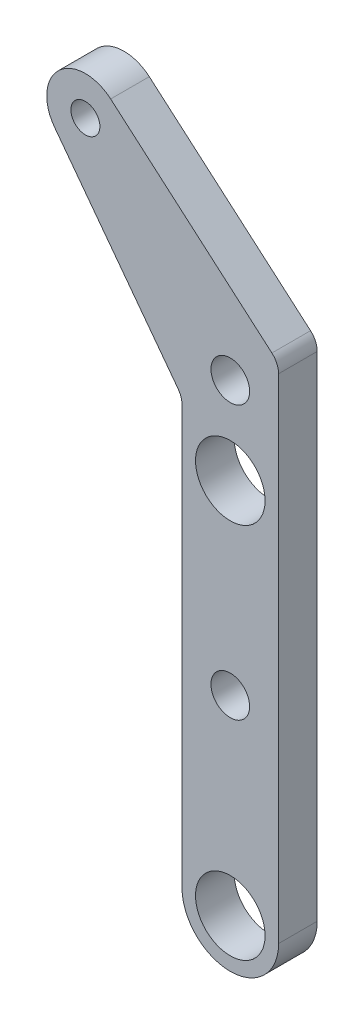
ISO-10303-21;
HEADER;
FILE_DESCRIPTION(('STEP AP214'),'2;1');
FILE_NAME('part.step','',(''),(''),'','','');
FILE_SCHEMA(('AUTOMOTIVE_DESIGN { 1 0 10303 214 1 1 1 1 }'));
ENDSEC;
DATA;
#1=APPLICATION_CONTEXT('core data for automotive mechanical design processes');
#2=APPLICATION_PROTOCOL_DEFINITION('international standard','automotive_design',2000,#1);
#3=PRODUCT_CONTEXT('',#1,'mechanical');
#4=PRODUCT('Part','Part','',(#3));
#5=PRODUCT_RELATED_PRODUCT_CATEGORY('part','',(#4));
#6=PRODUCT_DEFINITION_FORMATION('','',#4);
#7=PRODUCT_DEFINITION_CONTEXT('part definition',#1,'design');
#8=PRODUCT_DEFINITION('design','',#6,#7);
#9=PRODUCT_DEFINITION_SHAPE('','',#8);
#10=(LENGTH_UNIT() NAMED_UNIT(*) SI_UNIT(.MILLI.,.METRE.));
#11=(NAMED_UNIT(*) PLANE_ANGLE_UNIT() SI_UNIT($,.RADIAN.));
#12=(NAMED_UNIT(*) SI_UNIT($,.STERADIAN.) SOLID_ANGLE_UNIT());
#13=UNCERTAINTY_MEASURE_WITH_UNIT(LENGTH_MEASURE(1.E-05),#10,'distance_accuracy_value','');
#14=(GEOMETRIC_REPRESENTATION_CONTEXT(3) GLOBAL_UNCERTAINTY_ASSIGNED_CONTEXT((#13)) GLOBAL_UNIT_ASSIGNED_CONTEXT((#10,
#11,#12)) REPRESENTATION_CONTEXT('',''));
#15=CARTESIAN_POINT('',(0.,0.,0.));
#16=DIRECTION('',(0.,0.,1.));
#17=DIRECTION('',(1.,0.,0.));
#18=AXIS2_PLACEMENT_3D('',#15,#16,#17);
#19=CARTESIAN_POINT('',(-60.,0.,4.));
#20=DIRECTION('',(0.,0.,1.));
#21=DIRECTION('',(1.,0.,0.));
#22=AXIS2_PLACEMENT_3D('',#19,#20,#21);
#23=PLANE('',#22);
#24=CARTESIAN_POINT('',(-60.,48.,4.));
#25=DIRECTION('',(0.,0.,1.));
#26=DIRECTION('',(1.,0.,0.));
#27=AXIS2_PLACEMENT_3D('',#24,#25,#26);
#28=CIRCLE('',#27,2.);
#29=CARTESIAN_POINT('',(-58.,48.,4.));
#30=VERTEX_POINT('',#29);
#31=EDGE_CURVE('E325',#30,#30,#28,.T.);
#32=ORIENTED_EDGE('',*,*,#31,.F.);
#33=EDGE_LOOP('',(#32));
#34=FACE_BOUND('',#33,.T.);
#35=CARTESIAN_POINT('',(-75.,64.,4.));
#36=DIRECTION('',(0.,0.,1.));
#37=DIRECTION('',(1.,0.,0.));
#38=AXIS2_PLACEMENT_3D('',#35,#36,#37);
#39=CIRCLE('',#38,1.5);
#40=CARTESIAN_POINT('',(-73.5,64.,4.));
#41=VERTEX_POINT('',#40);
#42=EDGE_CURVE('E337',#41,#41,#39,.T.);
#43=ORIENTED_EDGE('',*,*,#42,.F.);
#44=EDGE_LOOP('',(#43));
#45=FACE_BOUND('',#44,.T.);
#46=DIRECTION('',(0.,1.,0.));
#47=VECTOR('',#46,1.);
#48=CARTESIAN_POINT('',(-55.,51.9999999999998,4.));
#49=LINE('',#48,#47);
#50=CARTESIAN_POINT('',(-55.,0.,4.));
#51=VERTEX_POINT('',#50);
#52=CARTESIAN_POINT('',(-55.,51.0851457844871,4.));
#53=VERTEX_POINT('',#52);
#54=EDGE_CURVE('E126',#51,#53,#49,.T.);
#55=ORIENTED_EDGE('',*,*,#54,.T.);
#56=CARTESIAN_POINT('',(-57.,51.0851457844871,4.));
#57=DIRECTION('',(0.,0.,1.));
#58=DIRECTION('',(1.,0.,0.));
#59=AXIS2_PLACEMENT_3D('',#56,#57,#58);
#60=CIRCLE('',#59,2.);
#61=CARTESIAN_POINT('',(-55.6921360035521,52.5982524452336,4.));
#62=VERTEX_POINT('',#61);
#63=EDGE_CURVE('E161',#53,#62,#60,.T.);
#64=ORIENTED_EDGE('',*,*,#63,.T.);
#65=DIRECTION('',(-0.756553330373234,0.65393199822395,0.));
#66=VECTOR('',#65,1.);
#67=CARTESIAN_POINT('',(-72.3842720071042,67.0262133214929,4.));
#68=LINE('',#67,#66);
#69=CARTESIAN_POINT('',(-72.3842720071042,67.0262133214929,4.));
#70=VERTEX_POINT('',#69);
#71=EDGE_CURVE('E128',#62,#70,#68,.T.);
#72=ORIENTED_EDGE('',*,*,#71,.T.);
#73=CARTESIAN_POINT('',(-75.,64.,4.));
#74=DIRECTION('',(0.,0.,1.));
#75=DIRECTION('',(1.,0.,0.));
#76=AXIS2_PLACEMENT_3D('',#73,#74,#75);
#77=CIRCLE('',#76,4.);
#78=CARTESIAN_POINT('',(-78.2,61.6,4.));
#79=VERTEX_POINT('',#78);
#80=EDGE_CURVE('E133',#70,#79,#77,.T.);
#81=ORIENTED_EDGE('',*,*,#80,.T.);
#82=DIRECTION('',(0.599999999999995,-0.800000000000004,0.));
#83=VECTOR('',#82,1.);
#84=CARTESIAN_POINT('',(-78.2,61.6,4.));
#85=LINE('',#84,#83);
#86=CARTESIAN_POINT('',(-65.4,44.5333333333331,4.));
#87=VERTEX_POINT('',#86);
#88=EDGE_CURVE('E111',#79,#87,#85,.T.);
#89=ORIENTED_EDGE('',*,*,#88,.T.);
#90=CARTESIAN_POINT('',(-67.,43.3333333333331,4.));
#91=DIRECTION('',(0.,0.,1.));
#92=DIRECTION('',(1.,0.,0.));
#93=AXIS2_PLACEMENT_3D('',#90,#91,#92);
#94=CIRCLE('',#93,2.);
#95=CARTESIAN_POINT('',(-65.,43.3333333333331,4.));
#96=VERTEX_POINT('',#95);
#97=EDGE_CURVE('E11',#87,#96,#94,.F.);
#98=ORIENTED_EDGE('',*,*,#97,.T.);
#99=DIRECTION('',(0.,-1.,0.));
#100=VECTOR('',#99,1.);
#101=CARTESIAN_POINT('',(-65.,0.,4.));
#102=LINE('',#101,#100);
#103=CARTESIAN_POINT('',(-65.,0.,4.));
#104=VERTEX_POINT('',#103);
#105=EDGE_CURVE('E101',#96,#104,#102,.T.);
#106=ORIENTED_EDGE('',*,*,#105,.T.);
#107=CARTESIAN_POINT('',(-60.,0.,4.));
#108=DIRECTION('',(0.,0.,1.));
#109=DIRECTION('',(1.,0.,0.));
#110=AXIS2_PLACEMENT_3D('',#107,#108,#109);
#111=CIRCLE('',#110,4.99999999999999);
#112=EDGE_CURVE('E106',#104,#51,#111,.T.);
#113=ORIENTED_EDGE('',*,*,#112,.T.);
#114=EDGE_LOOP('',(#55,#64,#72,#81,#89,#98,#106,#113));
#115=FACE_BOUND('',#114,.T.);
#116=CARTESIAN_POINT('',(-60.,0.,4.));
#117=DIRECTION('',(0.,0.,1.));
#118=DIRECTION('',(1.,0.,0.));
#119=AXIS2_PLACEMENT_3D('',#116,#117,#118);
#120=CIRCLE('',#119,3.6);
#121=CARTESIAN_POINT('',(-56.4,0.,4.));
#122=VERTEX_POINT('',#121);
#123=EDGE_CURVE('E138',#122,#122,#120,.T.);
#124=ORIENTED_EDGE('',*,*,#123,.F.);
#125=EDGE_LOOP('',(#124));
#126=FACE_BOUND('',#125,.T.);
#127=CARTESIAN_POINT('',(-60.,39.,4.));
#128=DIRECTION('',(0.,0.,1.));
#129=DIRECTION('',(1.,0.,0.));
#130=AXIS2_PLACEMENT_3D('',#127,#128,#129);
#131=CIRCLE('',#130,3.6);
#132=CARTESIAN_POINT('',(-56.4,39.,4.));
#133=VERTEX_POINT('',#132);
#134=EDGE_CURVE('E331',#133,#133,#131,.T.);
#135=ORIENTED_EDGE('',*,*,#134,.F.);
#136=EDGE_LOOP('',(#135));
#137=FACE_BOUND('',#136,.T.);
#138=CARTESIAN_POINT('',(-60.,19.75,4.));
#139=DIRECTION('',(0.,0.,1.));
#140=DIRECTION('',(1.,0.,0.));
#141=AXIS2_PLACEMENT_3D('',#138,#139,#140);
#142=CIRCLE('',#141,2.);
#143=CARTESIAN_POINT('',(-58.,19.75,4.));
#144=VERTEX_POINT('',#143);
#145=EDGE_CURVE('E316',#144,#144,#142,.T.);
#146=ORIENTED_EDGE('',*,*,#145,.F.);
#147=EDGE_LOOP('',(#146));
#148=FACE_BOUND('',#147,.T.);
#149=ADVANCED_FACE('F39',(#34,#45,#115,#126,#137,#148),#23,.T.);
#150=CARTESIAN_POINT('',(-60.,0.,0.));
#151=DIRECTION('',(0.,0.,1.));
#152=DIRECTION('',(1.,0.,0.));
#153=AXIS2_PLACEMENT_3D('',#150,#151,#152);
#154=PLANE('',#153);
#155=DIRECTION('',(-0.756553330373234,0.65393199822395,0.));
#156=VECTOR('',#155,1.);
#157=CARTESIAN_POINT('',(-72.3842720071042,67.0262133214929,0.));
#158=LINE('',#157,#156);
#159=CARTESIAN_POINT('',(-55.6921360035521,52.5982524452336,0.));
#160=VERTEX_POINT('',#159);
#161=CARTESIAN_POINT('',(-72.3842720071042,67.0262133214929,0.));
#162=VERTEX_POINT('',#161);
#163=EDGE_CURVE('E145',#160,#162,#158,.T.);
#164=ORIENTED_EDGE('',*,*,#163,.F.);
#165=CARTESIAN_POINT('',(-57.,51.0851457844871,0.));
#166=DIRECTION('',(0.,0.,1.));
#167=DIRECTION('',(1.,0.,0.));
#168=AXIS2_PLACEMENT_3D('',#165,#166,#167);
#169=CIRCLE('',#168,2.);
#170=CARTESIAN_POINT('',(-55.,51.0851457844871,0.));
#171=VERTEX_POINT('',#170);
#172=EDGE_CURVE('E157',#160,#171,#169,.F.);
#173=ORIENTED_EDGE('',*,*,#172,.T.);
#174=DIRECTION('',(0.,1.,0.));
#175=VECTOR('',#174,1.);
#176=CARTESIAN_POINT('',(-55.,51.9999999999998,0.));
#177=LINE('',#176,#175);
#178=CARTESIAN_POINT('',(-55.,0.,0.));
#179=VERTEX_POINT('',#178);
#180=EDGE_CURVE('E142',#179,#171,#177,.T.);
#181=ORIENTED_EDGE('',*,*,#180,.F.);
#182=CARTESIAN_POINT('',(-60.,0.,0.));
#183=DIRECTION('',(0.,0.,1.));
#184=DIRECTION('',(1.,0.,0.));
#185=AXIS2_PLACEMENT_3D('',#182,#183,#184);
#186=CIRCLE('',#185,4.99999999999999);
#187=CARTESIAN_POINT('',(-65.,0.,0.));
#188=VERTEX_POINT('',#187);
#189=EDGE_CURVE('E140',#188,#179,#186,.T.);
#190=ORIENTED_EDGE('',*,*,#189,.F.);
#191=DIRECTION('',(0.,-1.,0.));
#192=VECTOR('',#191,1.);
#193=CARTESIAN_POINT('',(-65.,0.,0.));
#194=LINE('',#193,#192);
#195=CARTESIAN_POINT('',(-65.,43.3333333333331,0.));
#196=VERTEX_POINT('',#195);
#197=EDGE_CURVE('E117',#196,#188,#194,.T.);
#198=ORIENTED_EDGE('',*,*,#197,.F.);
#199=CARTESIAN_POINT('',(-67.,43.3333333333331,0.));
#200=DIRECTION('',(0.,0.,1.));
#201=DIRECTION('',(1.,0.,0.));
#202=AXIS2_PLACEMENT_3D('',#199,#200,#201);
#203=CIRCLE('',#202,2.);
#204=CARTESIAN_POINT('',(-65.4,44.5333333333331,0.));
#205=VERTEX_POINT('',#204);
#206=EDGE_CURVE('E47',#196,#205,#203,.T.);
#207=ORIENTED_EDGE('',*,*,#206,.T.);
#208=DIRECTION('',(0.599999999999995,-0.800000000000004,0.));
#209=VECTOR('',#208,1.);
#210=CARTESIAN_POINT('',(-78.2,61.6,0.));
#211=LINE('',#210,#209);
#212=CARTESIAN_POINT('',(-78.2,61.6,0.));
#213=VERTEX_POINT('',#212);
#214=EDGE_CURVE('E136',#213,#205,#211,.T.);
#215=ORIENTED_EDGE('',*,*,#214,.F.);
#216=CARTESIAN_POINT('',(-75.,64.,0.));
#217=DIRECTION('',(0.,0.,1.));
#218=DIRECTION('',(1.,0.,0.));
#219=AXIS2_PLACEMENT_3D('',#216,#217,#218);
#220=CIRCLE('',#219,4.);
#221=EDGE_CURVE('E147',#162,#213,#220,.T.);
#222=ORIENTED_EDGE('',*,*,#221,.F.);
#223=EDGE_LOOP('',(#164,#173,#181,#190,#198,#207,#215,#222));
#224=FACE_BOUND('',#223,.T.);
#225=CARTESIAN_POINT('',(-60.,0.,0.));
#226=DIRECTION('',(0.,0.,1.));
#227=DIRECTION('',(1.,0.,0.));
#228=AXIS2_PLACEMENT_3D('',#225,#226,#227);
#229=CIRCLE('',#228,3.6);
#230=CARTESIAN_POINT('',(-56.4,0.,0.));
#231=VERTEX_POINT('',#230);
#232=EDGE_CURVE('E340',#231,#231,#229,.T.);
#233=ORIENTED_EDGE('',*,*,#232,.T.);
#234=EDGE_LOOP('',(#233));
#235=FACE_BOUND('',#234,.T.);
#236=CARTESIAN_POINT('',(-75.,64.,0.));
#237=DIRECTION('',(0.,0.,1.));
#238=DIRECTION('',(1.,0.,0.));
#239=AXIS2_PLACEMENT_3D('',#236,#237,#238);
#240=CIRCLE('',#239,1.5);
#241=CARTESIAN_POINT('',(-73.5,64.,0.));
#242=VERTEX_POINT('',#241);
#243=EDGE_CURVE('E334',#242,#242,#240,.T.);
#244=ORIENTED_EDGE('',*,*,#243,.T.);
#245=EDGE_LOOP('',(#244));
#246=FACE_BOUND('',#245,.T.);
#247=CARTESIAN_POINT('',(-60.,39.,0.));
#248=DIRECTION('',(0.,0.,1.));
#249=DIRECTION('',(1.,0.,0.));
#250=AXIS2_PLACEMENT_3D('',#247,#248,#249);
#251=CIRCLE('',#250,3.6);
#252=CARTESIAN_POINT('',(-56.4,39.,0.));
#253=VERTEX_POINT('',#252);
#254=EDGE_CURVE('E328',#253,#253,#251,.T.);
#255=ORIENTED_EDGE('',*,*,#254,.T.);
#256=EDGE_LOOP('',(#255));
#257=FACE_BOUND('',#256,.T.);
#258=CARTESIAN_POINT('',(-60.,48.,0.));
#259=DIRECTION('',(0.,0.,1.));
#260=DIRECTION('',(1.,0.,0.));
#261=AXIS2_PLACEMENT_3D('',#258,#259,#260);
#262=CIRCLE('',#261,2.);
#263=CARTESIAN_POINT('',(-58.,48.,0.));
#264=VERTEX_POINT('',#263);
#265=EDGE_CURVE('E322',#264,#264,#262,.T.);
#266=ORIENTED_EDGE('',*,*,#265,.T.);
#267=EDGE_LOOP('',(#266));
#268=FACE_BOUND('',#267,.T.);
#269=CARTESIAN_POINT('',(-60.,19.75,0.));
#270=DIRECTION('',(0.,0.,1.));
#271=DIRECTION('',(1.,0.,0.));
#272=AXIS2_PLACEMENT_3D('',#269,#270,#271);
#273=CIRCLE('',#272,2.);
#274=CARTESIAN_POINT('',(-58.,19.75,0.));
#275=VERTEX_POINT('',#274);
#276=EDGE_CURVE('E319',#275,#275,#273,.T.);
#277=ORIENTED_EDGE('',*,*,#276,.T.);
#278=EDGE_LOOP('',(#277));
#279=FACE_BOUND('',#278,.T.);
#280=ADVANCED_FACE('F168',(#224,#235,#246,#257,#268,#279),#154,.F.);
#281=CARTESIAN_POINT('',(-78.2,61.6,4.));
#282=DIRECTION('',(0.800000000000004,0.599999999999995,0.));
#283=DIRECTION('',(-0.599999999999995,0.800000000000004,0.));
#284=AXIS2_PLACEMENT_3D('',#281,#282,#283);
#285=PLANE('',#284);
#286=ORIENTED_EDGE('',*,*,#214,.T.);
#287=DIRECTION('',(0.,0.,-1.));
#288=VECTOR('',#287,1.);
#289=CARTESIAN_POINT('',(-65.4,44.5333333333331,4.));
#290=LINE('',#289,#288);
#291=EDGE_CURVE('E60',#205,#87,#290,.F.);
#292=ORIENTED_EDGE('',*,*,#291,.T.);
#293=ORIENTED_EDGE('',*,*,#88,.F.);
#294=DIRECTION('',(0.,0.,-1.));
#295=VECTOR('',#294,1.);
#296=CARTESIAN_POINT('',(-78.2,61.6,4.));
#297=LINE('',#296,#295);
#298=EDGE_CURVE('E135',#79,#213,#297,.T.);
#299=ORIENTED_EDGE('',*,*,#298,.T.);
#300=EDGE_LOOP('',(#286,#292,#293,#299));
#301=FACE_BOUND('',#300,.T.);
#302=ADVANCED_FACE('F172',(#301),#285,.F.);
#303=CARTESIAN_POINT('',(-65.,0.,4.));
#304=DIRECTION('',(1.,0.,0.));
#305=DIRECTION('',(0.,1.,0.));
#306=AXIS2_PLACEMENT_3D('',#303,#304,#305);
#307=PLANE('',#306);
#308=ORIENTED_EDGE('',*,*,#105,.F.);
#309=DIRECTION('',(0.,0.,-1.));
#310=VECTOR('',#309,1.);
#311=CARTESIAN_POINT('',(-65.,43.3333333333331,0.));
#312=LINE('',#311,#310);
#313=EDGE_CURVE('E163',#96,#196,#312,.T.);
#314=ORIENTED_EDGE('',*,*,#313,.T.);
#315=ORIENTED_EDGE('',*,*,#197,.T.);
#316=DIRECTION('',(0.,0.,-1.));
#317=VECTOR('',#316,1.);
#318=CARTESIAN_POINT('',(-65.,0.,4.));
#319=LINE('',#318,#317);
#320=EDGE_CURVE('E114',#104,#188,#319,.T.);
#321=ORIENTED_EDGE('',*,*,#320,.F.);
#322=EDGE_LOOP('',(#308,#314,#315,#321));
#323=FACE_BOUND('',#322,.T.);
#324=ADVANCED_FACE('F115',(#323),#307,.F.);
#325=CARTESIAN_POINT('',(-60.,0.,4.));
#326=DIRECTION('',(0.,0.,-1.));
#327=DIRECTION('',(-1.,0.,0.));
#328=AXIS2_PLACEMENT_3D('',#325,#326,#327);
#329=CYLINDRICAL_SURFACE('',#328,4.99999999999999);
#330=ORIENTED_EDGE('',*,*,#189,.T.);
#331=DIRECTION('',(0.,0.,-1.));
#332=VECTOR('',#331,1.);
#333=CARTESIAN_POINT('',(-55.,0.,4.));
#334=LINE('',#333,#332);
#335=EDGE_CURVE('E121',#51,#179,#334,.T.);
#336=ORIENTED_EDGE('',*,*,#335,.F.);
#337=ORIENTED_EDGE('',*,*,#112,.F.);
#338=ORIENTED_EDGE('',*,*,#320,.T.);
#339=EDGE_LOOP('',(#330,#336,#337,#338));
#340=FACE_BOUND('',#339,.T.);
#341=ADVANCED_FACE('F123',(#340),#329,.T.);
#342=CARTESIAN_POINT('',(-55.,51.9999999999998,4.));
#343=DIRECTION('',(-1.,0.,0.));
#344=DIRECTION('',(0.,-1.,0.));
#345=AXIS2_PLACEMENT_3D('',#342,#343,#344);
#346=PLANE('',#345);
#347=ORIENTED_EDGE('',*,*,#180,.T.);
#348=DIRECTION('',(0.,0.,-1.));
#349=VECTOR('',#348,1.);
#350=CARTESIAN_POINT('',(-55.,51.0851457844871,4.));
#351=LINE('',#350,#349);
#352=EDGE_CURVE('E159',#171,#53,#351,.F.);
#353=ORIENTED_EDGE('',*,*,#352,.T.);
#354=ORIENTED_EDGE('',*,*,#54,.F.);
#355=ORIENTED_EDGE('',*,*,#335,.T.);
#356=EDGE_LOOP('',(#347,#353,#354,#355));
#357=FACE_BOUND('',#356,.T.);
#358=ADVANCED_FACE('F201',(#357),#346,.F.);
#359=CARTESIAN_POINT('',(-72.3842720071042,67.0262133214929,4.));
#360=DIRECTION('',(-0.65393199822395,-0.756553330373234,0.));
#361=DIRECTION('',(0.756553330373235,-0.65393199822395,0.));
#362=AXIS2_PLACEMENT_3D('',#359,#360,#361);
#363=PLANE('',#362);
#364=ORIENTED_EDGE('',*,*,#71,.F.);
#365=DIRECTION('',(0.,0.,-1.));
#366=VECTOR('',#365,1.);
#367=CARTESIAN_POINT('',(-55.6921360035521,52.5982524452336,4.));
#368=LINE('',#367,#366);
#369=EDGE_CURVE('E120',#62,#160,#368,.T.);
#370=ORIENTED_EDGE('',*,*,#369,.T.);
#371=ORIENTED_EDGE('',*,*,#163,.T.);
#372=DIRECTION('',(0.,0.,-1.));
#373=VECTOR('',#372,1.);
#374=CARTESIAN_POINT('',(-72.3842720071042,67.0262133214929,4.));
#375=LINE('',#374,#373);
#376=EDGE_CURVE('E151',#70,#162,#375,.T.);
#377=ORIENTED_EDGE('',*,*,#376,.F.);
#378=EDGE_LOOP('',(#364,#370,#371,#377));
#379=FACE_BOUND('',#378,.T.);
#380=ADVANCED_FACE('F197',(#379),#363,.F.);
#381=CARTESIAN_POINT('',(-75.,64.,4.));
#382=DIRECTION('',(0.,0.,-1.));
#383=DIRECTION('',(-1.,0.,0.));
#384=AXIS2_PLACEMENT_3D('',#381,#382,#383);
#385=CYLINDRICAL_SURFACE('',#384,4.);
#386=ORIENTED_EDGE('',*,*,#221,.T.);
#387=ORIENTED_EDGE('',*,*,#298,.F.);
#388=ORIENTED_EDGE('',*,*,#80,.F.);
#389=ORIENTED_EDGE('',*,*,#376,.T.);
#390=EDGE_LOOP('',(#386,#387,#388,#389));
#391=FACE_BOUND('',#390,.T.);
#392=ADVANCED_FACE('F194',(#391),#385,.T.);
#393=CARTESIAN_POINT('',(-60.,0.,4.));
#394=DIRECTION('',(0.,0.,-1.));
#395=DIRECTION('',(-1.,0.,0.));
#396=AXIS2_PLACEMENT_3D('',#393,#394,#395);
#397=CYLINDRICAL_SURFACE('',#396,3.6);
#398=ORIENTED_EDGE('',*,*,#123,.T.);
#399=EDGE_LOOP('',(#398));
#400=FACE_BOUND('',#399,.T.);
#401=ORIENTED_EDGE('',*,*,#232,.F.);
#402=EDGE_LOOP('',(#401));
#403=FACE_BOUND('',#402,.T.);
#404=ADVANCED_FACE('F191',(#400,#403),#397,.F.);
#405=CARTESIAN_POINT('',(-75.,64.,4.));
#406=DIRECTION('',(0.,0.,-1.));
#407=DIRECTION('',(-1.,0.,0.));
#408=AXIS2_PLACEMENT_3D('',#405,#406,#407);
#409=CYLINDRICAL_SURFACE('',#408,1.5);
#410=ORIENTED_EDGE('',*,*,#42,.T.);
#411=EDGE_LOOP('',(#410));
#412=FACE_BOUND('',#411,.T.);
#413=ORIENTED_EDGE('',*,*,#243,.F.);
#414=EDGE_LOOP('',(#413));
#415=FACE_BOUND('',#414,.T.);
#416=ADVANCED_FACE('F242',(#412,#415),#409,.F.);
#417=CARTESIAN_POINT('',(-60.,39.,4.));
#418=DIRECTION('',(0.,0.,-1.));
#419=DIRECTION('',(-1.,0.,0.));
#420=AXIS2_PLACEMENT_3D('',#417,#418,#419);
#421=CYLINDRICAL_SURFACE('',#420,3.6);
#422=ORIENTED_EDGE('',*,*,#134,.T.);
#423=EDGE_LOOP('',(#422));
#424=FACE_BOUND('',#423,.T.);
#425=ORIENTED_EDGE('',*,*,#254,.F.);
#426=EDGE_LOOP('',(#425));
#427=FACE_BOUND('',#426,.T.);
#428=ADVANCED_FACE('F249',(#424,#427),#421,.F.);
#429=CARTESIAN_POINT('',(-60.,48.,4.));
#430=DIRECTION('',(0.,0.,-1.));
#431=DIRECTION('',(-1.,0.,0.));
#432=AXIS2_PLACEMENT_3D('',#429,#430,#431);
#433=CYLINDRICAL_SURFACE('',#432,2.);
#434=ORIENTED_EDGE('',*,*,#31,.T.);
#435=EDGE_LOOP('',(#434));
#436=FACE_BOUND('',#435,.T.);
#437=ORIENTED_EDGE('',*,*,#265,.F.);
#438=EDGE_LOOP('',(#437));
#439=FACE_BOUND('',#438,.T.);
#440=ADVANCED_FACE('F256',(#436,#439),#433,.F.);
#441=CARTESIAN_POINT('',(-60.,19.75,4.));
#442=DIRECTION('',(0.,0.,-1.));
#443=DIRECTION('',(-1.,0.,0.));
#444=AXIS2_PLACEMENT_3D('',#441,#442,#443);
#445=CYLINDRICAL_SURFACE('',#444,2.);
#446=ORIENTED_EDGE('',*,*,#145,.T.);
#447=EDGE_LOOP('',(#446));
#448=FACE_BOUND('',#447,.T.);
#449=ORIENTED_EDGE('',*,*,#276,.F.);
#450=EDGE_LOOP('',(#449));
#451=FACE_BOUND('',#450,.T.);
#452=ADVANCED_FACE('F179',(#448,#451),#445,.F.);
#453=CARTESIAN_POINT('',(-57.,51.0851457844871,4.));
#454=DIRECTION('',(0.,0.,-1.));
#455=DIRECTION('',(-1.,0.,0.));
#456=AXIS2_PLACEMENT_3D('',#453,#454,#455);
#457=CYLINDRICAL_SURFACE('',#456,2.);
#458=ORIENTED_EDGE('',*,*,#63,.F.);
#459=ORIENTED_EDGE('',*,*,#352,.F.);
#460=ORIENTED_EDGE('',*,*,#172,.F.);
#461=ORIENTED_EDGE('',*,*,#369,.F.);
#462=EDGE_LOOP('',(#458,#459,#460,#461));
#463=FACE_BOUND('',#462,.T.);
#464=ADVANCED_FACE('F175',(#463),#457,.T.);
#465=CARTESIAN_POINT('',(-67.,43.3333333333331,4.));
#466=DIRECTION('',(0.,0.,1.));
#467=DIRECTION('',(1.,0.,0.));
#468=AXIS2_PLACEMENT_3D('',#465,#466,#467);
#469=CYLINDRICAL_SURFACE('',#468,2.);
#470=ORIENTED_EDGE('',*,*,#97,.F.);
#471=ORIENTED_EDGE('',*,*,#291,.F.);
#472=ORIENTED_EDGE('',*,*,#206,.F.);
#473=ORIENTED_EDGE('',*,*,#313,.F.);
#474=EDGE_LOOP('',(#470,#471,#472,#473));
#475=FACE_BOUND('',#474,.T.);
#476=ADVANCED_FACE('F41',(#475),#469,.F.);
#477=CLOSED_SHELL('',(#149,#280,#302,#324,#341,#358,#380,#392,#404,#416,#428,#440,#452,#464,#476));
#478=MANIFOLD_SOLID_BREP('B2',#477);
#479=ADVANCED_BREP_SHAPE_REPRESENTATION('',(#18,#478),#14);
#480=SHAPE_DEFINITION_REPRESENTATION(#9,#479);
ENDSEC;
END-ISO-10303-21;
